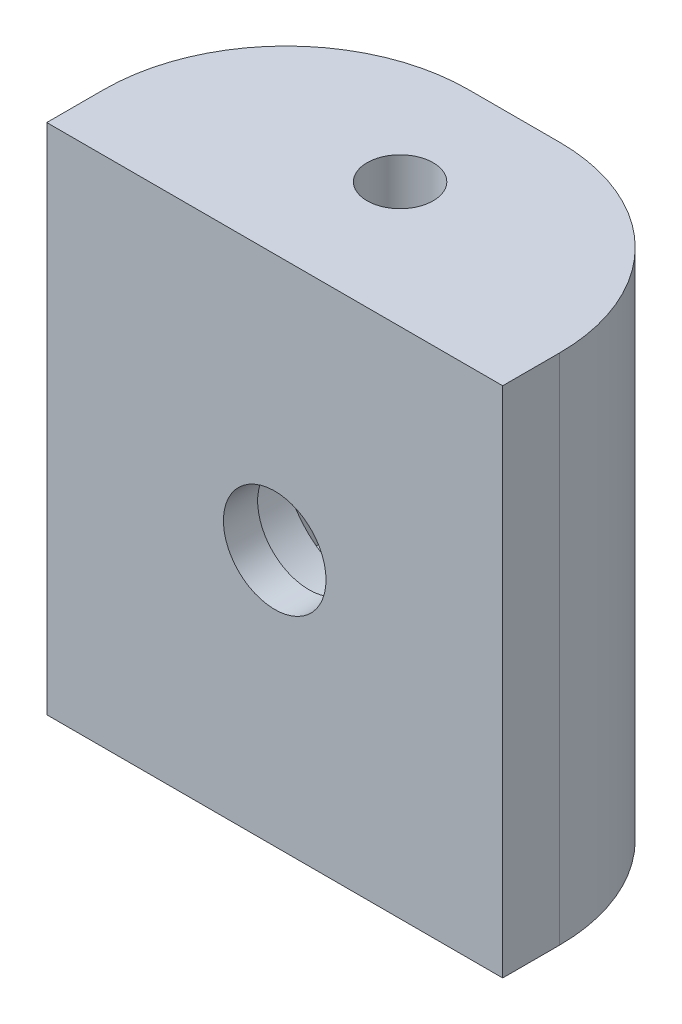
ISO-10303-21;
HEADER;
FILE_DESCRIPTION(('STEP AP214'),'2;1');
FILE_NAME('part.step','',(''),(''),'','','');
FILE_SCHEMA(('AUTOMOTIVE_DESIGN { 1 0 10303 214 1 1 1 1 }'));
ENDSEC;
DATA;
#1=APPLICATION_CONTEXT('core data for automotive mechanical design processes');
#2=APPLICATION_PROTOCOL_DEFINITION('international standard','automotive_design',2000,#1);
#3=PRODUCT_CONTEXT('',#1,'mechanical');
#4=PRODUCT('Part','Part','',(#3));
#5=PRODUCT_RELATED_PRODUCT_CATEGORY('part','',(#4));
#6=PRODUCT_DEFINITION_FORMATION('','',#4);
#7=PRODUCT_DEFINITION_CONTEXT('part definition',#1,'design');
#8=PRODUCT_DEFINITION('design','',#6,#7);
#9=PRODUCT_DEFINITION_SHAPE('','',#8);
#10=(LENGTH_UNIT() NAMED_UNIT(*) SI_UNIT(.MILLI.,.METRE.));
#11=(NAMED_UNIT(*) PLANE_ANGLE_UNIT() SI_UNIT($,.RADIAN.));
#12=(NAMED_UNIT(*) SI_UNIT($,.STERADIAN.) SOLID_ANGLE_UNIT());
#13=UNCERTAINTY_MEASURE_WITH_UNIT(LENGTH_MEASURE(1.E-05),#10,'distance_accuracy_value','');
#14=(GEOMETRIC_REPRESENTATION_CONTEXT(3) GLOBAL_UNCERTAINTY_ASSIGNED_CONTEXT((#13)) GLOBAL_UNIT_ASSIGNED_CONTEXT((#10,
#11,#12)) REPRESENTATION_CONTEXT('',''));
#15=CARTESIAN_POINT('',(0.,0.,0.));
#16=DIRECTION('',(0.,0.,1.));
#17=DIRECTION('',(1.,0.,0.));
#18=AXIS2_PLACEMENT_3D('',#15,#16,#17);
#19=CARTESIAN_POINT('',(0.,0.,-6.5));
#20=DIRECTION('',(0.,0.,-1.));
#21=DIRECTION('',(-1.,0.,0.));
#22=AXIS2_PLACEMENT_3D('',#19,#20,#21);
#23=PLANE('',#22);
#24=DIRECTION('',(-1.,0.,0.));
#25=VECTOR('',#24,1.);
#26=CARTESIAN_POINT('',(0.,-22.5,-6.5));
#27=LINE('',#26,#25);
#28=CARTESIAN_POINT('',(12.,-22.5,-6.5));
#29=VERTEX_POINT('',#28);
#30=CARTESIAN_POINT('',(8.00000000000001,-22.5,-6.5));
#31=VERTEX_POINT('',#30);
#32=EDGE_CURVE('E158',#29,#31,#27,.T.);
#33=ORIENTED_EDGE('',*,*,#32,.T.);
#34=DIRECTION('',(0.,1.,0.));
#35=VECTOR('',#34,1.);
#36=CARTESIAN_POINT('',(8.,0.,-6.5));
#37=LINE('',#36,#35);
#38=CARTESIAN_POINT('',(8.00000000000001,-18.,-6.5));
#39=VERTEX_POINT('',#38);
#40=EDGE_CURVE('E209',#31,#39,#37,.T.);
#41=ORIENTED_EDGE('',*,*,#40,.T.);
#42=DIRECTION('',(1.,0.,0.));
#43=VECTOR('',#42,1.);
#44=CARTESIAN_POINT('',(0.,-18.,-6.5));
#45=LINE('',#44,#43);
#46=CARTESIAN_POINT('',(12.,-18.,-6.5));
#47=VERTEX_POINT('',#46);
#48=EDGE_CURVE('E137',#39,#47,#45,.T.);
#49=ORIENTED_EDGE('',*,*,#48,.T.);
#50=DIRECTION('',(0.,-1.,0.));
#51=VECTOR('',#50,1.);
#52=CARTESIAN_POINT('',(12.,-22.5,-6.5));
#53=LINE('',#52,#51);
#54=EDGE_CURVE('E198',#47,#29,#53,.T.);
#55=ORIENTED_EDGE('',*,*,#54,.T.);
#56=EDGE_LOOP('',(#33,#41,#49,#55));
#57=FACE_BOUND('',#56,.T.);
#58=ADVANCED_FACE('F35',(#57),#23,.T.);
#59=CARTESIAN_POINT('',(0.,0.,4.));
#60=DIRECTION('',(1.,0.,0.));
#61=DIRECTION('',(0.,1.,0.));
#62=AXIS2_PLACEMENT_3D('',#59,#60,#61);
#63=PLANE('',#62);
#64=DIRECTION('',(0.,0.,-1.));
#65=VECTOR('',#64,1.);
#66=CARTESIAN_POINT('',(0.,0.,4.));
#67=LINE('',#66,#65);
#68=CARTESIAN_POINT('',(0.,0.,4.));
#69=VERTEX_POINT('',#68);
#70=CARTESIAN_POINT('',(0.,0.,1.5));
#71=VERTEX_POINT('',#70);
#72=EDGE_CURVE('E189',#69,#71,#67,.T.);
#73=ORIENTED_EDGE('',*,*,#72,.T.);
#74=DIRECTION('',(0.,1.,0.));
#75=VECTOR('',#74,1.);
#76=CARTESIAN_POINT('',(0.,-22.5,1.5));
#77=LINE('',#76,#75);
#78=CARTESIAN_POINT('',(0.,-22.5,1.5));
#79=VERTEX_POINT('',#78);
#80=EDGE_CURVE('E58',#71,#79,#77,.F.);
#81=ORIENTED_EDGE('',*,*,#80,.T.);
#82=DIRECTION('',(0.,0.,-1.));
#83=VECTOR('',#82,1.);
#84=CARTESIAN_POINT('',(0.,-22.5,4.));
#85=LINE('',#84,#83);
#86=CARTESIAN_POINT('',(0.,-22.5,4.));
#87=VERTEX_POINT('',#86);
#88=EDGE_CURVE('E196',#87,#79,#85,.T.);
#89=ORIENTED_EDGE('',*,*,#88,.F.);
#90=DIRECTION('',(0.,-1.,0.));
#91=VECTOR('',#90,1.);
#92=CARTESIAN_POINT('',(0.,0.,4.));
#93=LINE('',#92,#91);
#94=EDGE_CURVE('E180',#69,#87,#93,.T.);
#95=ORIENTED_EDGE('',*,*,#94,.F.);
#96=EDGE_LOOP('',(#73,#81,#89,#95));
#97=FACE_BOUND('',#96,.T.);
#98=ADVANCED_FACE('F278',(#97),#63,.F.);
#99=CARTESIAN_POINT('',(0.,-22.5,4.));
#100=DIRECTION('',(0.,1.,0.));
#101=DIRECTION('',(0.,0.,1.));
#102=AXIS2_PLACEMENT_3D('',#99,#100,#101);
#103=PLANE('',#102);
#104=CARTESIAN_POINT('',(10.,-22.5,-1.5));
#105=DIRECTION('',(0.,1.,0.));
#106=DIRECTION('',(0.,0.,1.));
#107=AXIS2_PLACEMENT_3D('',#104,#105,#106);
#108=CIRCLE('',#107,1.45);
#109=CARTESIAN_POINT('',(10.,-22.5,-0.0499999999999997));
#110=VERTEX_POINT('',#109);
#111=EDGE_CURVE('E202',#110,#110,#108,.T.);
#112=ORIENTED_EDGE('',*,*,#111,.T.);
#113=EDGE_LOOP('',(#112));
#114=FACE_BOUND('',#113,.T.);
#115=ORIENTED_EDGE('',*,*,#88,.T.);
#116=CARTESIAN_POINT('',(8.00000000000001,-22.5,1.5));
#117=DIRECTION('',(0.,1.,0.));
#118=DIRECTION('',(0.,0.,1.));
#119=AXIS2_PLACEMENT_3D('',#116,#117,#118);
#120=CIRCLE('',#119,8.);
#121=EDGE_CURVE('E228',#79,#31,#120,.F.);
#122=ORIENTED_EDGE('',*,*,#121,.T.);
#123=ORIENTED_EDGE('',*,*,#32,.F.);
#124=CARTESIAN_POINT('',(12.,-22.5,1.5));
#125=DIRECTION('',(0.,1.,0.));
#126=DIRECTION('',(0.,0.,1.));
#127=AXIS2_PLACEMENT_3D('',#124,#125,#126);
#128=CIRCLE('',#127,8.);
#129=CARTESIAN_POINT('',(20.,-22.5,1.5));
#130=VERTEX_POINT('',#129);
#131=EDGE_CURVE('E50',#29,#130,#128,.F.);
#132=ORIENTED_EDGE('',*,*,#131,.T.);
#133=DIRECTION('',(0.,0.,-1.));
#134=VECTOR('',#133,1.);
#135=CARTESIAN_POINT('',(20.,-22.5,4.));
#136=LINE('',#135,#134);
#137=CARTESIAN_POINT('',(20.,-22.5,4.));
#138=VERTEX_POINT('',#137);
#139=EDGE_CURVE('E194',#138,#130,#136,.T.);
#140=ORIENTED_EDGE('',*,*,#139,.F.);
#141=DIRECTION('',(1.,0.,0.));
#142=VECTOR('',#141,1.);
#143=CARTESIAN_POINT('',(0.,-22.5,4.));
#144=LINE('',#143,#142);
#145=EDGE_CURVE('E183',#87,#138,#144,.T.);
#146=ORIENTED_EDGE('',*,*,#145,.F.);
#147=EDGE_LOOP('',(#115,#122,#123,#132,#140,#146));
#148=FACE_BOUND('',#147,.T.);
#149=ADVANCED_FACE('F231',(#114,#148),#103,.F.);
#150=CARTESIAN_POINT('',(20.,0.,4.));
#151=DIRECTION('',(-1.,0.,0.));
#152=DIRECTION('',(0.,-1.,0.));
#153=AXIS2_PLACEMENT_3D('',#150,#151,#152);
#154=PLANE('',#153);
#155=ORIENTED_EDGE('',*,*,#139,.T.);
#156=DIRECTION('',(0.,-1.,0.));
#157=VECTOR('',#156,1.);
#158=CARTESIAN_POINT('',(20.,0.,1.5));
#159=LINE('',#158,#157);
#160=CARTESIAN_POINT('',(20.,0.,1.5));
#161=VERTEX_POINT('',#160);
#162=EDGE_CURVE('E11',#130,#161,#159,.F.);
#163=ORIENTED_EDGE('',*,*,#162,.T.);
#164=DIRECTION('',(0.,0.,-1.));
#165=VECTOR('',#164,1.);
#166=CARTESIAN_POINT('',(20.,0.,4.));
#167=LINE('',#166,#165);
#168=CARTESIAN_POINT('',(20.,0.,4.));
#169=VERTEX_POINT('',#168);
#170=EDGE_CURVE('E191',#169,#161,#167,.T.);
#171=ORIENTED_EDGE('',*,*,#170,.F.);
#172=DIRECTION('',(0.,1.,0.));
#173=VECTOR('',#172,1.);
#174=CARTESIAN_POINT('',(20.,0.,4.));
#175=LINE('',#174,#173);
#176=EDGE_CURVE('E185',#138,#169,#175,.T.);
#177=ORIENTED_EDGE('',*,*,#176,.F.);
#178=EDGE_LOOP('',(#155,#163,#171,#177));
#179=FACE_BOUND('',#178,.T.);
#180=ADVANCED_FACE('F320',(#179),#154,.F.);
#181=CARTESIAN_POINT('',(0.,0.,4.));
#182=DIRECTION('',(0.,-1.,0.));
#183=DIRECTION('',(0.,0.,-1.));
#184=AXIS2_PLACEMENT_3D('',#181,#182,#183);
#185=PLANE('',#184);
#186=CARTESIAN_POINT('',(10.,0.,-1.5));
#187=DIRECTION('',(0.,1.,0.));
#188=DIRECTION('',(0.,0.,1.));
#189=AXIS2_PLACEMENT_3D('',#186,#187,#188);
#190=CIRCLE('',#189,1.45);
#191=CARTESIAN_POINT('',(10.,0.,-0.0499999999999997));
#192=VERTEX_POINT('',#191);
#193=EDGE_CURVE('E253',#192,#192,#190,.T.);
#194=ORIENTED_EDGE('',*,*,#193,.F.);
#195=EDGE_LOOP('',(#194));
#196=FACE_BOUND('',#195,.T.);
#197=DIRECTION('',(1.,0.,0.));
#198=VECTOR('',#197,1.);
#199=CARTESIAN_POINT('',(0.,0.,-6.5));
#200=LINE('',#199,#198);
#201=CARTESIAN_POINT('',(8.,0.,-6.5));
#202=VERTEX_POINT('',#201);
#203=CARTESIAN_POINT('',(12.,0.,-6.5));
#204=VERTEX_POINT('',#203);
#205=EDGE_CURVE('E154',#202,#204,#200,.T.);
#206=ORIENTED_EDGE('',*,*,#205,.F.);
#207=CARTESIAN_POINT('',(8.,0.,1.5));
#208=DIRECTION('',(0.,-1.,0.));
#209=DIRECTION('',(0.,0.,-1.));
#210=AXIS2_PLACEMENT_3D('',#207,#208,#209);
#211=CIRCLE('',#210,8.);
#212=EDGE_CURVE('E224',#202,#71,#211,.F.);
#213=ORIENTED_EDGE('',*,*,#212,.T.);
#214=ORIENTED_EDGE('',*,*,#72,.F.);
#215=DIRECTION('',(-1.,0.,0.));
#216=VECTOR('',#215,1.);
#217=CARTESIAN_POINT('',(0.,0.,4.));
#218=LINE('',#217,#216);
#219=EDGE_CURVE('E187',#169,#69,#218,.T.);
#220=ORIENTED_EDGE('',*,*,#219,.F.);
#221=ORIENTED_EDGE('',*,*,#170,.T.);
#222=CARTESIAN_POINT('',(12.,0.,1.5));
#223=DIRECTION('',(0.,-1.,0.));
#224=DIRECTION('',(0.,0.,-1.));
#225=AXIS2_PLACEMENT_3D('',#222,#223,#224);
#226=CIRCLE('',#225,8.);
#227=EDGE_CURVE('E222',#161,#204,#226,.F.);
#228=ORIENTED_EDGE('',*,*,#227,.T.);
#229=EDGE_LOOP('',(#206,#213,#214,#220,#221,#228));
#230=FACE_BOUND('',#229,.T.);
#231=ADVANCED_FACE('F314',(#196,#230),#185,.F.);
#232=CARTESIAN_POINT('',(0.,0.,4.));
#233=DIRECTION('',(0.,0.,1.));
#234=DIRECTION('',(1.,0.,0.));
#235=AXIS2_PLACEMENT_3D('',#232,#233,#234);
#236=PLANE('',#235);
#237=CARTESIAN_POINT('',(10.,-11.25,4.));
#238=DIRECTION('',(0.,0.,1.));
#239=DIRECTION('',(1.,0.,0.));
#240=AXIS2_PLACEMENT_3D('',#237,#238,#239);
#241=CIRCLE('',#240,2.25);
#242=CARTESIAN_POINT('',(12.25,-11.25,4.));
#243=VERTEX_POINT('',#242);
#244=EDGE_CURVE('E177',#243,#243,#241,.T.);
#245=ORIENTED_EDGE('',*,*,#244,.F.);
#246=EDGE_LOOP('',(#245));
#247=FACE_BOUND('',#246,.T.);
#248=ORIENTED_EDGE('',*,*,#94,.T.);
#249=ORIENTED_EDGE('',*,*,#145,.T.);
#250=ORIENTED_EDGE('',*,*,#176,.T.);
#251=ORIENTED_EDGE('',*,*,#219,.T.);
#252=EDGE_LOOP('',(#248,#249,#250,#251));
#253=FACE_BOUND('',#252,.T.);
#254=ADVANCED_FACE('F311',(#247,#253),#236,.T.);
#255=CARTESIAN_POINT('',(0.,0.,0.));
#256=DIRECTION('',(0.,0.,1.));
#257=DIRECTION('',(1.,0.,0.));
#258=AXIS2_PLACEMENT_3D('',#255,#256,#257);
#259=PLANE('',#258);
#260=DIRECTION('',(-1.,0.,0.));
#261=VECTOR('',#260,1.);
#262=CARTESIAN_POINT('',(0.,-4.5,0.));
#263=LINE('',#262,#261);
#264=CARTESIAN_POINT('',(16.,-4.5,0.));
#265=VERTEX_POINT('',#264);
#266=CARTESIAN_POINT('',(4.,-4.5,0.));
#267=VERTEX_POINT('',#266);
#268=EDGE_CURVE('E148',#265,#267,#263,.T.);
#269=ORIENTED_EDGE('',*,*,#268,.F.);
#270=DIRECTION('',(0.,-1.,0.));
#271=VECTOR('',#270,1.);
#272=CARTESIAN_POINT('',(16.,0.,0.));
#273=LINE('',#272,#271);
#274=CARTESIAN_POINT('',(16.,-18.,0.));
#275=VERTEX_POINT('',#274);
#276=EDGE_CURVE('E131',#265,#275,#273,.T.);
#277=ORIENTED_EDGE('',*,*,#276,.T.);
#278=DIRECTION('',(1.,0.,0.));
#279=VECTOR('',#278,1.);
#280=CARTESIAN_POINT('',(0.,-18.,0.));
#281=LINE('',#280,#279);
#282=CARTESIAN_POINT('',(4.,-18.,0.));
#283=VERTEX_POINT('',#282);
#284=EDGE_CURVE('E145',#283,#275,#281,.T.);
#285=ORIENTED_EDGE('',*,*,#284,.F.);
#286=DIRECTION('',(0.,-1.,0.));
#287=VECTOR('',#286,1.);
#288=CARTESIAN_POINT('',(4.,0.,0.));
#289=LINE('',#288,#287);
#290=EDGE_CURVE('E155',#267,#283,#289,.T.);
#291=ORIENTED_EDGE('',*,*,#290,.F.);
#292=EDGE_LOOP('',(#269,#277,#285,#291));
#293=FACE_BOUND('',#292,.T.);
#294=CARTESIAN_POINT('',(10.,-11.25,0.));
#295=DIRECTION('',(0.,0.,1.));
#296=DIRECTION('',(1.,0.,0.));
#297=AXIS2_PLACEMENT_3D('',#294,#295,#296);
#298=CIRCLE('',#297,3.65);
#299=CARTESIAN_POINT('',(13.65,-11.25,0.));
#300=VERTEX_POINT('',#299);
#301=EDGE_CURVE('E169',#300,#300,#298,.T.);
#302=ORIENTED_EDGE('',*,*,#301,.T.);
#303=EDGE_LOOP('',(#302));
#304=FACE_BOUND('',#303,.T.);
#305=ADVANCED_FACE('F142',(#293,#304),#259,.F.);
#306=CARTESIAN_POINT('',(10.,-11.25,2.5));
#307=DIRECTION('',(0.,0.,1.));
#308=DIRECTION('',(1.,0.,0.));
#309=AXIS2_PLACEMENT_3D('',#306,#307,#308);
#310=CYLINDRICAL_SURFACE('',#309,2.25);
#311=CARTESIAN_POINT('',(10.,-11.25,2.5));
#312=DIRECTION('',(0.,0.,1.));
#313=DIRECTION('',(1.,0.,0.));
#314=AXIS2_PLACEMENT_3D('',#311,#312,#313);
#315=CIRCLE('',#314,2.25);
#316=CARTESIAN_POINT('',(12.25,-11.25,2.5));
#317=VERTEX_POINT('',#316);
#318=EDGE_CURVE('E172',#317,#317,#315,.F.);
#319=ORIENTED_EDGE('',*,*,#318,.T.);
#320=EDGE_LOOP('',(#319));
#321=FACE_BOUND('',#320,.T.);
#322=ORIENTED_EDGE('',*,*,#244,.T.);
#323=EDGE_LOOP('',(#322));
#324=FACE_BOUND('',#323,.T.);
#325=ADVANCED_FACE('F303',(#321,#324),#310,.F.);
#326=CARTESIAN_POINT('',(10.,-11.25,2.5));
#327=DIRECTION('',(0.,0.,1.));
#328=DIRECTION('',(1.,0.,0.));
#329=AXIS2_PLACEMENT_3D('',#326,#327,#328);
#330=PLANE('',#329);
#331=CARTESIAN_POINT('',(10.,-11.25,2.5));
#332=DIRECTION('',(0.,0.,1.));
#333=DIRECTION('',(1.,0.,0.));
#334=AXIS2_PLACEMENT_3D('',#331,#332,#333);
#335=CIRCLE('',#334,3.65);
#336=CARTESIAN_POINT('',(13.65,-11.25,2.5));
#337=VERTEX_POINT('',#336);
#338=EDGE_CURVE('E168',#337,#337,#335,.T.);
#339=ORIENTED_EDGE('',*,*,#338,.F.);
#340=EDGE_LOOP('',(#339));
#341=FACE_BOUND('',#340,.T.);
#342=ORIENTED_EDGE('',*,*,#318,.F.);
#343=EDGE_LOOP('',(#342));
#344=FACE_BOUND('',#343,.T.);
#345=ADVANCED_FACE('F300',(#341,#344),#330,.F.);
#346=CARTESIAN_POINT('',(10.,-11.25,0.));
#347=DIRECTION('',(0.,0.,1.));
#348=DIRECTION('',(1.,0.,0.));
#349=AXIS2_PLACEMENT_3D('',#346,#347,#348);
#350=CYLINDRICAL_SURFACE('',#349,3.65);
#351=ORIENTED_EDGE('',*,*,#301,.F.);
#352=EDGE_LOOP('',(#351));
#353=FACE_BOUND('',#352,.T.);
#354=ORIENTED_EDGE('',*,*,#338,.T.);
#355=EDGE_LOOP('',(#354));
#356=FACE_BOUND('',#355,.T.);
#357=ADVANCED_FACE('F297',(#353,#356),#350,.F.);
#358=CARTESIAN_POINT('',(16.,0.,-6.5));
#359=DIRECTION('',(-1.,0.,0.));
#360=DIRECTION('',(0.,0.,1.));
#361=AXIS2_PLACEMENT_3D('',#358,#359,#360);
#362=PLANE('',#361);
#363=DIRECTION('',(0.,0.,1.));
#364=VECTOR('',#363,1.);
#365=CARTESIAN_POINT('',(16.,-4.5,-6.5));
#366=LINE('',#365,#364);
#367=CARTESIAN_POINT('',(16.,-4.5,-5.4282032302755));
#368=VERTEX_POINT('',#367);
#369=EDGE_CURVE('E166',#368,#265,#366,.T.);
#370=ORIENTED_EDGE('',*,*,#369,.F.);
#371=DIRECTION('',(0.,1.,0.));
#372=VECTOR('',#371,1.);
#373=CARTESIAN_POINT('',(16.,-4.5,-5.4282032302755));
#374=LINE('',#373,#372);
#375=CARTESIAN_POINT('',(16.,-18.,-5.42820323027551));
#376=VERTEX_POINT('',#375);
#377=EDGE_CURVE('E43',#368,#376,#374,.F.);
#378=ORIENTED_EDGE('',*,*,#377,.T.);
#379=DIRECTION('',(0.,0.,1.));
#380=VECTOR('',#379,1.);
#381=CARTESIAN_POINT('',(16.,-18.,-6.5));
#382=LINE('',#381,#380);
#383=EDGE_CURVE('E127',#376,#275,#382,.T.);
#384=ORIENTED_EDGE('',*,*,#383,.T.);
#385=ORIENTED_EDGE('',*,*,#276,.F.);
#386=EDGE_LOOP('',(#370,#378,#384,#385));
#387=FACE_BOUND('',#386,.T.);
#388=ADVANCED_FACE('F130',(#387),#362,.T.);
#389=CARTESIAN_POINT('',(0.,-4.5,-6.5));
#390=DIRECTION('',(0.,1.,0.));
#391=DIRECTION('',(0.,0.,1.));
#392=AXIS2_PLACEMENT_3D('',#389,#390,#391);
#393=PLANE('',#392);
#394=CARTESIAN_POINT('',(10.,-4.5,-1.5));
#395=DIRECTION('',(0.,1.,0.));
#396=DIRECTION('',(0.,0.,1.));
#397=AXIS2_PLACEMENT_3D('',#394,#395,#396);
#398=CIRCLE('',#397,1.45);
#399=CARTESIAN_POINT('',(10.,-4.50000000000001,-0.0499999999999997));
#400=VERTEX_POINT('',#399);
#401=EDGE_CURVE('E149',#400,#400,#398,.T.);
#402=ORIENTED_EDGE('',*,*,#401,.T.);
#403=EDGE_LOOP('',(#402));
#404=FACE_BOUND('',#403,.T.);
#405=DIRECTION('',(0.,0.,1.));
#406=VECTOR('',#405,1.);
#407=CARTESIAN_POINT('',(4.,-4.5,-6.5));
#408=LINE('',#407,#406);
#409=CARTESIAN_POINT('',(4.,-4.5,-5.42820323027551));
#410=VERTEX_POINT('',#409);
#411=EDGE_CURVE('E164',#410,#267,#408,.T.);
#412=ORIENTED_EDGE('',*,*,#411,.F.);
#413=CARTESIAN_POINT('',(8.,-4.5,1.5));
#414=DIRECTION('',(0.,1.,0.));
#415=DIRECTION('',(0.,0.,1.));
#416=AXIS2_PLACEMENT_3D('',#413,#414,#415);
#417=CIRCLE('',#416,8.);
#418=CARTESIAN_POINT('',(8.,-4.5,-6.5));
#419=VERTEX_POINT('',#418);
#420=EDGE_CURVE('E220',#410,#419,#417,.F.);
#421=ORIENTED_EDGE('',*,*,#420,.T.);
#422=DIRECTION('',(-1.,0.,0.));
#423=VECTOR('',#422,1.);
#424=CARTESIAN_POINT('',(0.,-4.5,-6.5));
#425=LINE('',#424,#423);
#426=CARTESIAN_POINT('',(12.,-4.5,-6.5));
#427=VERTEX_POINT('',#426);
#428=EDGE_CURVE('E237',#427,#419,#425,.T.);
#429=ORIENTED_EDGE('',*,*,#428,.F.);
#430=CARTESIAN_POINT('',(12.,-4.5,1.5));
#431=DIRECTION('',(0.,1.,0.));
#432=DIRECTION('',(0.,0.,1.));
#433=AXIS2_PLACEMENT_3D('',#430,#431,#432);
#434=CIRCLE('',#433,8.);
#435=EDGE_CURVE('E218',#427,#368,#434,.F.);
#436=ORIENTED_EDGE('',*,*,#435,.T.);
#437=ORIENTED_EDGE('',*,*,#369,.T.);
#438=ORIENTED_EDGE('',*,*,#268,.T.);
#439=EDGE_LOOP('',(#412,#421,#429,#436,#437,#438));
#440=FACE_BOUND('',#439,.T.);
#441=ADVANCED_FACE('F246',(#404,#440),#393,.F.);
#442=CARTESIAN_POINT('',(4.,0.,-6.5));
#443=DIRECTION('',(-1.,0.,0.));
#444=DIRECTION('',(0.,-1.,0.));
#445=AXIS2_PLACEMENT_3D('',#442,#443,#444);
#446=PLANE('',#445);
#447=DIRECTION('',(0.,0.,1.));
#448=VECTOR('',#447,1.);
#449=CARTESIAN_POINT('',(4.,-18.,-6.5));
#450=LINE('',#449,#448);
#451=CARTESIAN_POINT('',(4.,-18.,-5.42820323027551));
#452=VERTEX_POINT('',#451);
#453=EDGE_CURVE('E136',#452,#283,#450,.T.);
#454=ORIENTED_EDGE('',*,*,#453,.F.);
#455=DIRECTION('',(0.,-1.,0.));
#456=VECTOR('',#455,1.);
#457=CARTESIAN_POINT('',(4.,-18.,-5.42820323027551));
#458=LINE('',#457,#456);
#459=EDGE_CURVE('E216',#452,#410,#458,.F.);
#460=ORIENTED_EDGE('',*,*,#459,.T.);
#461=ORIENTED_EDGE('',*,*,#411,.T.);
#462=ORIENTED_EDGE('',*,*,#290,.T.);
#463=EDGE_LOOP('',(#454,#460,#461,#462));
#464=FACE_BOUND('',#463,.T.);
#465=ADVANCED_FACE('F243',(#464),#446,.F.);
#466=CARTESIAN_POINT('',(0.,-18.,-6.5));
#467=DIRECTION('',(0.,-1.,0.));
#468=DIRECTION('',(1.,0.,0.));
#469=AXIS2_PLACEMENT_3D('',#466,#467,#468);
#470=PLANE('',#469);
#471=CARTESIAN_POINT('',(10.,-18.,-1.5));
#472=DIRECTION('',(0.,-1.,0.));
#473=DIRECTION('',(1.,0.,0.));
#474=AXIS2_PLACEMENT_3D('',#471,#472,#473);
#475=CIRCLE('',#474,1.45);
#476=CARTESIAN_POINT('',(10.,-18.,-0.0499999999999997));
#477=VERTEX_POINT('',#476);
#478=EDGE_CURVE('E199',#477,#477,#475,.T.);
#479=ORIENTED_EDGE('',*,*,#478,.T.);
#480=EDGE_LOOP('',(#479));
#481=FACE_BOUND('',#480,.T.);
#482=ORIENTED_EDGE('',*,*,#48,.F.);
#483=CARTESIAN_POINT('',(8.00000000000001,-18.,1.5));
#484=DIRECTION('',(0.,-1.,0.));
#485=DIRECTION('',(1.,0.,0.));
#486=AXIS2_PLACEMENT_3D('',#483,#484,#485);
#487=CIRCLE('',#486,8.);
#488=EDGE_CURVE('E214',#39,#452,#487,.F.);
#489=ORIENTED_EDGE('',*,*,#488,.T.);
#490=ORIENTED_EDGE('',*,*,#453,.T.);
#491=ORIENTED_EDGE('',*,*,#284,.T.);
#492=ORIENTED_EDGE('',*,*,#383,.F.);
#493=CARTESIAN_POINT('',(12.,-18.,1.5));
#494=DIRECTION('',(0.,-1.,0.));
#495=DIRECTION('',(1.,0.,0.));
#496=AXIS2_PLACEMENT_3D('',#493,#494,#495);
#497=CIRCLE('',#496,8.);
#498=EDGE_CURVE('E212',#376,#47,#497,.F.);
#499=ORIENTED_EDGE('',*,*,#498,.T.);
#500=EDGE_LOOP('',(#482,#489,#490,#491,#492,#499));
#501=FACE_BOUND('',#500,.T.);
#502=ADVANCED_FACE('F152',(#481,#501),#470,.F.);
#503=ORIENTED_EDGE('',*,*,#428,.T.);
#504=DIRECTION('',(0.,1.,0.));
#505=VECTOR('',#504,1.);
#506=CARTESIAN_POINT('',(8.,0.,-6.5));
#507=LINE('',#506,#505);
#508=EDGE_CURVE('E207',#419,#202,#507,.T.);
#509=ORIENTED_EDGE('',*,*,#508,.T.);
#510=ORIENTED_EDGE('',*,*,#205,.T.);
#511=DIRECTION('',(0.,-1.,0.));
#512=VECTOR('',#511,1.);
#513=CARTESIAN_POINT('',(12.,-22.5,-6.5));
#514=LINE('',#513,#512);
#515=EDGE_CURVE('E204',#204,#427,#514,.T.);
#516=ORIENTED_EDGE('',*,*,#515,.T.);
#517=EDGE_LOOP('',(#503,#509,#510,#516));
#518=FACE_BOUND('',#517,.T.);
#519=ADVANCED_FACE('F264',(#518),#23,.T.);
#520=CARTESIAN_POINT('',(10.,-22.5,-1.5));
#521=DIRECTION('',(0.,1.,0.));
#522=DIRECTION('',(0.,0.,1.));
#523=AXIS2_PLACEMENT_3D('',#520,#521,#522);
#524=CYLINDRICAL_SURFACE('',#523,1.45);
#525=CARTESIAN_POINT('',(10.,-22.5,-0.0499999999999997));
#526=CARTESIAN_POINT('',(10.,-22.453125,-0.0499999999999997));
#527=CARTESIAN_POINT('',(10.,-22.40625,-0.0499999999999997));
#528=CARTESIAN_POINT('',(10.,-22.3125,-0.0499999999999997));
#529=CARTESIAN_POINT('',(10.,-22.265625,-0.0499999999999997));
#530=CARTESIAN_POINT('',(10.,-22.171875,-0.0499999999999997));
#531=CARTESIAN_POINT('',(10.,-22.125,-0.0499999999999997));
#532=CARTESIAN_POINT('',(10.,-22.03125,-0.0499999999999997));
#533=CARTESIAN_POINT('',(10.,-21.984375,-0.0499999999999997));
#534=CARTESIAN_POINT('',(10.,-21.890625,-0.0499999999999997));
#535=CARTESIAN_POINT('',(10.,-21.84375,-0.0499999999999997));
#536=CARTESIAN_POINT('',(10.,-21.75,-0.0499999999999997));
#537=CARTESIAN_POINT('',(10.,-21.703125,-0.0499999999999997));
#538=CARTESIAN_POINT('',(10.,-21.609375,-0.0499999999999997));
#539=CARTESIAN_POINT('',(10.,-21.5625,-0.0499999999999997));
#540=CARTESIAN_POINT('',(10.,-21.46875,-0.0499999999999997));
#541=CARTESIAN_POINT('',(10.,-21.421875,-0.0499999999999997));
#542=CARTESIAN_POINT('',(10.,-21.328125,-0.0499999999999997));
#543=CARTESIAN_POINT('',(10.,-21.28125,-0.0499999999999997));
#544=CARTESIAN_POINT('',(10.,-21.1875,-0.0499999999999997));
#545=CARTESIAN_POINT('',(10.,-21.140625,-0.0499999999999997));
#546=CARTESIAN_POINT('',(10.,-21.046875,-0.0499999999999997));
#547=CARTESIAN_POINT('',(10.,-21.,-0.0499999999999997));
#548=CARTESIAN_POINT('',(10.,-20.90625,-0.0499999999999997));
#549=CARTESIAN_POINT('',(10.,-20.859375,-0.0499999999999997));
#550=CARTESIAN_POINT('',(10.,-20.765625,-0.0499999999999997));
#551=CARTESIAN_POINT('',(10.,-20.71875,-0.0499999999999997));
#552=CARTESIAN_POINT('',(10.,-20.625,-0.0499999999999997));
#553=CARTESIAN_POINT('',(10.,-20.578125,-0.0499999999999997));
#554=CARTESIAN_POINT('',(10.,-20.484375,-0.0499999999999997));
#555=CARTESIAN_POINT('',(10.,-20.4375,-0.0499999999999997));
#556=CARTESIAN_POINT('',(10.,-20.34375,-0.0499999999999997));
#557=CARTESIAN_POINT('',(10.,-20.296875,-0.0499999999999997));
#558=CARTESIAN_POINT('',(10.,-20.203125,-0.0499999999999997));
#559=CARTESIAN_POINT('',(10.,-20.15625,-0.0499999999999997));
#560=CARTESIAN_POINT('',(10.,-20.0625,-0.0499999999999997));
#561=CARTESIAN_POINT('',(10.,-20.015625,-0.0499999999999997));
#562=CARTESIAN_POINT('',(10.,-19.921875,-0.0499999999999997));
#563=CARTESIAN_POINT('',(10.,-19.875,-0.0499999999999997));
#564=CARTESIAN_POINT('',(10.,-19.78125,-0.0499999999999997));
#565=CARTESIAN_POINT('',(10.,-19.734375,-0.0499999999999997));
#566=CARTESIAN_POINT('',(10.,-19.640625,-0.0499999999999997));
#567=CARTESIAN_POINT('',(10.,-19.59375,-0.0499999999999997));
#568=CARTESIAN_POINT('',(10.,-19.5,-0.0499999999999997));
#569=CARTESIAN_POINT('',(10.,-19.453125,-0.0499999999999997));
#570=CARTESIAN_POINT('',(10.,-19.359375,-0.0499999999999997));
#571=CARTESIAN_POINT('',(10.,-19.3125,-0.0499999999999997));
#572=CARTESIAN_POINT('',(10.,-19.21875,-0.0499999999999997));
#573=CARTESIAN_POINT('',(10.,-19.171875,-0.0499999999999997));
#574=CARTESIAN_POINT('',(10.,-19.078125,-0.0499999999999997));
#575=CARTESIAN_POINT('',(10.,-19.03125,-0.0499999999999997));
#576=CARTESIAN_POINT('',(10.,-18.9375,-0.0499999999999997));
#577=CARTESIAN_POINT('',(10.,-18.890625,-0.0499999999999997));
#578=CARTESIAN_POINT('',(10.,-18.796875,-0.0499999999999997));
#579=CARTESIAN_POINT('',(10.,-18.75,-0.0499999999999997));
#580=CARTESIAN_POINT('',(10.,-18.65625,-0.0499999999999997));
#581=CARTESIAN_POINT('',(10.,-18.609375,-0.0499999999999997));
#582=CARTESIAN_POINT('',(10.,-18.515625,-0.0499999999999997));
#583=CARTESIAN_POINT('',(10.,-18.46875,-0.0499999999999997));
#584=CARTESIAN_POINT('',(10.,-18.375,-0.0499999999999997));
#585=CARTESIAN_POINT('',(10.,-18.328125,-0.0499999999999997));
#586=CARTESIAN_POINT('',(10.,-18.234375,-0.0499999999999997));
#587=CARTESIAN_POINT('',(10.,-18.1875,-0.0499999999999997));
#588=CARTESIAN_POINT('',(10.,-18.09375,-0.0499999999999997));
#589=CARTESIAN_POINT('',(10.,-18.046875,-0.0499999999999997));
#590=CARTESIAN_POINT('',(10.,-18.,-0.0499999999999997));
#591=B_SPLINE_CURVE_WITH_KNOTS('',3,(#525,#526,#527,#528,#529,#530,#531,#532,#533,#534,#535,
#536,#537,#538,#539,#540,#541,#542,#543,#544,#545,#546,#547,#548,#549,#550,#551,#552,#553,#554,
#555,#556,#557,#558,#559,#560,#561,#562,#563,#564,#565,#566,#567,#568,#569,#570,#571,#572,#573,
#574,#575,#576,#577,#578,#579,#580,#581,#582,#583,#584,#585,#586,#587,#588,#589,#590),
.UNSPECIFIED.,.F.,.F.,(4,2,2,2,2,2,2,2,2,2,2,2,2,2,2,2,2,2,2,2,2,2,2,2,2,2,2,2,2,2,2,2,4),(0.,
0.140625000000002,0.28125,0.421875000000002,0.5625,0.703125000000002,0.843750000000001,
0.984375000000003,1.125,1.265625,1.40625,1.546875,1.6875,1.828125,1.96875,2.109375,2.25,
2.390625,2.53125,2.671875,2.8125,2.953125,3.09375,3.234375,3.375,3.515625,3.65625,3.796875,
3.9375,4.078125,4.21875,4.359375,4.5),.UNSPECIFIED.);
#592=EDGE_CURVE('BSEAM260',#110,#477,#591,.T.);
#593=ORIENTED_EDGE('',*,*,#111,.F.);
#594=ORIENTED_EDGE('',*,*,#478,.F.);
#595=ORIENTED_EDGE('',*,*,#592,.T.);
#596=ORIENTED_EDGE('',*,*,#592,.F.);
#597=EDGE_LOOP('',(#593,#595,#594,#596));
#598=FACE_BOUND('',#597,.T.);
#599=ADVANCED_FACE('F260',(#598),#524,.F.);
#600=CARTESIAN_POINT('',(10.,0.,-0.0499999999999997));
#601=CARTESIAN_POINT('',(10.,-0.0468750000000029,-0.0499999999999997));
#602=CARTESIAN_POINT('',(10.,-0.0937500000000024,-0.0499999999999997));
#603=CARTESIAN_POINT('',(10.,-0.187500000000002,-0.0499999999999997));
#604=CARTESIAN_POINT('',(10.,-0.234375000000003,-0.0499999999999997));
#605=CARTESIAN_POINT('',(10.,-0.328125000000004,-0.0499999999999997));
#606=CARTESIAN_POINT('',(10.,-0.375000000000005,-0.0499999999999997));
#607=CARTESIAN_POINT('',(10.,-0.468750000000005,-0.0499999999999997));
#608=CARTESIAN_POINT('',(10.,-0.515625000000004,-0.0499999999999997));
#609=CARTESIAN_POINT('',(10.,-0.609375000000003,-0.0499999999999997));
#610=CARTESIAN_POINT('',(10.,-0.656250000000003,-0.0499999999999997));
#611=CARTESIAN_POINT('',(10.,-0.750000000000003,-0.0499999999999997));
#612=CARTESIAN_POINT('',(10.,-0.796875000000004,-0.0499999999999997));
#613=CARTESIAN_POINT('',(10.,-0.890625000000005,-0.0499999999999997));
#614=CARTESIAN_POINT('',(10.,-0.937500000000005,-0.0499999999999997));
#615=CARTESIAN_POINT('',(10.,-1.03125000000001,-0.0499999999999997));
#616=CARTESIAN_POINT('',(10.,-1.07812500000001,-0.0499999999999997));
#617=CARTESIAN_POINT('',(10.,-1.171875,-0.0499999999999997));
#618=CARTESIAN_POINT('',(10.,-1.21875,-0.0499999999999997));
#619=CARTESIAN_POINT('',(10.,-1.3125,-0.0499999999999997));
#620=CARTESIAN_POINT('',(10.,-1.359375,-0.0499999999999997));
#621=CARTESIAN_POINT('',(10.,-1.45312500000001,-0.0499999999999997));
#622=CARTESIAN_POINT('',(10.,-1.50000000000001,-0.0499999999999997));
#623=CARTESIAN_POINT('',(10.,-1.59375000000001,-0.0499999999999997));
#624=CARTESIAN_POINT('',(10.,-1.64062500000001,-0.0499999999999997));
#625=CARTESIAN_POINT('',(10.,-1.734375,-0.0499999999999997));
#626=CARTESIAN_POINT('',(10.,-1.78125,-0.0499999999999997));
#627=CARTESIAN_POINT('',(10.,-1.875,-0.0499999999999997));
#628=CARTESIAN_POINT('',(10.,-1.921875,-0.0499999999999997));
#629=CARTESIAN_POINT('',(10.,-2.01562500000001,-0.0499999999999997));
#630=CARTESIAN_POINT('',(10.,-2.06250000000001,-0.0499999999999997));
#631=CARTESIAN_POINT('',(10.,-2.15625000000001,-0.0499999999999997));
#632=CARTESIAN_POINT('',(10.,-2.20312500000001,-0.0499999999999997));
#633=CARTESIAN_POINT('',(10.,-2.296875,-0.0499999999999997));
#634=CARTESIAN_POINT('',(10.,-2.34375,-0.0499999999999997));
#635=CARTESIAN_POINT('',(10.,-2.4375,-0.0499999999999997));
#636=CARTESIAN_POINT('',(10.,-2.48437500000001,-0.0499999999999997));
#637=CARTESIAN_POINT('',(10.,-2.57812500000001,-0.0499999999999997));
#638=CARTESIAN_POINT('',(10.,-2.62500000000001,-0.0499999999999997));
#639=CARTESIAN_POINT('',(10.,-2.71875000000001,-0.0499999999999997));
#640=CARTESIAN_POINT('',(10.,-2.76562500000001,-0.0499999999999997));
#641=CARTESIAN_POINT('',(10.,-2.85937500000001,-0.0499999999999997));
#642=CARTESIAN_POINT('',(10.,-2.90625,-0.0499999999999997));
#643=CARTESIAN_POINT('',(10.,-3.,-0.0499999999999997));
#644=CARTESIAN_POINT('',(10.,-3.04687500000001,-0.0499999999999997));
#645=CARTESIAN_POINT('',(10.,-3.14062500000001,-0.0499999999999997));
#646=CARTESIAN_POINT('',(10.,-3.18750000000001,-0.0499999999999997));
#647=CARTESIAN_POINT('',(10.,-3.28125000000001,-0.0499999999999997));
#648=CARTESIAN_POINT('',(10.,-3.32812500000001,-0.0499999999999997));
#649=CARTESIAN_POINT('',(10.,-3.42187500000001,-0.0499999999999997));
#650=CARTESIAN_POINT('',(10.,-3.46875000000001,-0.0499999999999997));
#651=CARTESIAN_POINT('',(10.,-3.56250000000001,-0.0499999999999997));
#652=CARTESIAN_POINT('',(10.,-3.60937500000001,-0.0499999999999997));
#653=CARTESIAN_POINT('',(10.,-3.70312500000001,-0.0499999999999997));
#654=CARTESIAN_POINT('',(10.,-3.75000000000001,-0.0499999999999997));
#655=CARTESIAN_POINT('',(10.,-3.84375000000001,-0.0499999999999997));
#656=CARTESIAN_POINT('',(10.,-3.89062500000001,-0.0499999999999997));
#657=CARTESIAN_POINT('',(10.,-3.98437500000001,-0.0499999999999997));
#658=CARTESIAN_POINT('',(10.,-4.03125000000001,-0.0499999999999997));
#659=CARTESIAN_POINT('',(10.,-4.12500000000001,-0.0499999999999997));
#660=CARTESIAN_POINT('',(10.,-4.17187500000001,-0.0499999999999997));
#661=CARTESIAN_POINT('',(10.,-4.26562500000001,-0.0499999999999997));
#662=CARTESIAN_POINT('',(10.,-4.31250000000001,-0.0499999999999997));
#663=CARTESIAN_POINT('',(10.,-4.40625000000001,-0.0499999999999997));
#664=CARTESIAN_POINT('',(10.,-4.45312500000001,-0.0499999999999997));
#665=CARTESIAN_POINT('',(10.,-4.50000000000001,-0.0499999999999997));
#666=B_SPLINE_CURVE_WITH_KNOTS('',3,(#600,#601,#602,#603,#604,#605,#606,#607,#608,#609,#610,
#611,#612,#613,#614,#615,#616,#617,#618,#619,#620,#621,#622,#623,#624,#625,#626,#627,#628,#629,
#630,#631,#632,#633,#634,#635,#636,#637,#638,#639,#640,#641,#642,#643,#644,#645,#646,#647,#648,
#649,#650,#651,#652,#653,#654,#655,#656,#657,#658,#659,#660,#661,#662,#663,#664,#665),
.UNSPECIFIED.,.F.,.F.,(4,2,2,2,2,2,2,2,2,2,2,2,2,2,2,2,2,2,2,2,2,2,2,2,2,2,2,2,2,2,2,2,4),(0.,
0.140624999999998,0.28125,0.421875000000002,0.5625,0.703124999999999,0.843750000000001,
0.984375000000003,1.125,1.265625,1.40625,1.546875,1.6875,1.828125,1.96875,2.109375,2.25,
2.390625,2.53125,2.671875,2.8125,2.953125,3.09375,3.234375,3.375,3.515625,3.65625,
3.79687500000001,3.9375,4.078125,4.21875,4.35937500000001,4.5),.UNSPECIFIED.);
#667=EDGE_CURVE('BSEAM263',#192,#400,#666,.T.);
#668=ORIENTED_EDGE('',*,*,#193,.T.);
#669=ORIENTED_EDGE('',*,*,#401,.F.);
#670=ORIENTED_EDGE('',*,*,#667,.T.);
#671=ORIENTED_EDGE('',*,*,#667,.F.);
#672=EDGE_LOOP('',(#668,#670,#669,#671));
#673=FACE_BOUND('',#672,.T.);
#674=ADVANCED_FACE('F263',(#673),#524,.F.);
#675=CARTESIAN_POINT('',(8.,0.,1.5));
#676=DIRECTION('',(0.,-1.,0.));
#677=DIRECTION('',(1.,0.,0.));
#678=AXIS2_PLACEMENT_3D('',#675,#676,#677);
#679=CYLINDRICAL_SURFACE('',#678,8.);
#680=ORIENTED_EDGE('',*,*,#121,.F.);
#681=ORIENTED_EDGE('',*,*,#80,.F.);
#682=ORIENTED_EDGE('',*,*,#212,.F.);
#683=ORIENTED_EDGE('',*,*,#508,.F.);
#684=ORIENTED_EDGE('',*,*,#420,.F.);
#685=ORIENTED_EDGE('',*,*,#459,.F.);
#686=ORIENTED_EDGE('',*,*,#488,.F.);
#687=ORIENTED_EDGE('',*,*,#40,.F.);
#688=EDGE_LOOP('',(#680,#681,#682,#683,#684,#685,#686,#687));
#689=FACE_BOUND('',#688,.T.);
#690=ADVANCED_FACE('F239',(#689),#679,.T.);
#691=CARTESIAN_POINT('',(12.,0.,1.5));
#692=DIRECTION('',(0.,1.,0.));
#693=DIRECTION('',(-1.,0.,0.));
#694=AXIS2_PLACEMENT_3D('',#691,#692,#693);
#695=CYLINDRICAL_SURFACE('',#694,8.);
#696=ORIENTED_EDGE('',*,*,#227,.F.);
#697=ORIENTED_EDGE('',*,*,#162,.F.);
#698=ORIENTED_EDGE('',*,*,#131,.F.);
#699=ORIENTED_EDGE('',*,*,#54,.F.);
#700=ORIENTED_EDGE('',*,*,#498,.F.);
#701=ORIENTED_EDGE('',*,*,#377,.F.);
#702=ORIENTED_EDGE('',*,*,#435,.F.);
#703=ORIENTED_EDGE('',*,*,#515,.F.);
#704=EDGE_LOOP('',(#696,#697,#698,#699,#700,#701,#702,#703));
#705=FACE_BOUND('',#704,.T.);
#706=ADVANCED_FACE('F37',(#705),#695,.T.);
#707=CLOSED_SHELL('',(#58,#98,#149,#180,#231,#254,#305,#325,#345,#357,#388,#441,#465,#502,#519,
#599,#674,#690,#706));
#708=MANIFOLD_SOLID_BREP('B2',#707);
#709=ADVANCED_BREP_SHAPE_REPRESENTATION('',(#18,#708),#14);
#710=SHAPE_DEFINITION_REPRESENTATION(#9,#709);
ENDSEC;
END-ISO-10303-21;
